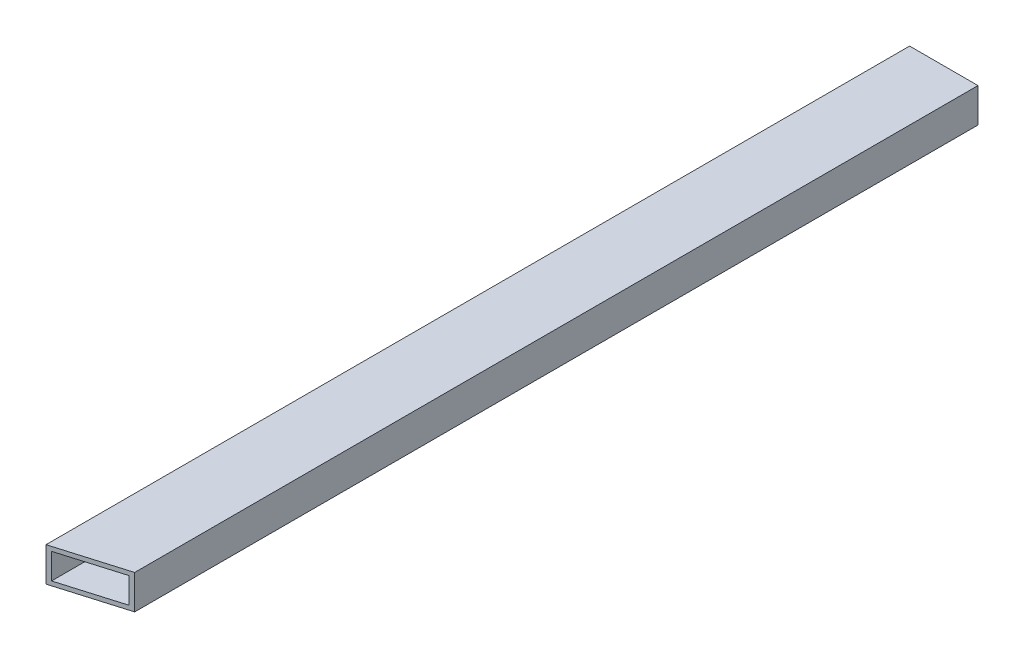
ISO-10303-21;
HEADER;
FILE_DESCRIPTION(('STEP AP214'),'2;1');
FILE_NAME('part.step','',(''),(''),'','','');
FILE_SCHEMA(('AUTOMOTIVE_DESIGN { 1 0 10303 214 1 1 1 1 }'));
ENDSEC;
DATA;
#1=APPLICATION_CONTEXT('core data for automotive mechanical design processes');
#2=APPLICATION_PROTOCOL_DEFINITION('international standard','automotive_design',2000,#1);
#3=PRODUCT_CONTEXT('',#1,'mechanical');
#4=PRODUCT('Part','Part','',(#3));
#5=PRODUCT_RELATED_PRODUCT_CATEGORY('part','',(#4));
#6=PRODUCT_DEFINITION_FORMATION('','',#4);
#7=PRODUCT_DEFINITION_CONTEXT('part definition',#1,'design');
#8=PRODUCT_DEFINITION('design','',#6,#7);
#9=PRODUCT_DEFINITION_SHAPE('','',#8);
#10=(LENGTH_UNIT() NAMED_UNIT(*) SI_UNIT(.MILLI.,.METRE.));
#11=(NAMED_UNIT(*) PLANE_ANGLE_UNIT() SI_UNIT($,.RADIAN.));
#12=(NAMED_UNIT(*) SI_UNIT($,.STERADIAN.) SOLID_ANGLE_UNIT());
#13=UNCERTAINTY_MEASURE_WITH_UNIT(LENGTH_MEASURE(1.E-05),#10,'distance_accuracy_value','');
#14=(GEOMETRIC_REPRESENTATION_CONTEXT(3) GLOBAL_UNCERTAINTY_ASSIGNED_CONTEXT((#13)) GLOBAL_UNIT_ASSIGNED_CONTEXT((#10,
#11,#12)) REPRESENTATION_CONTEXT('',''));
#15=CARTESIAN_POINT('',(0.,0.,0.));
#16=DIRECTION('',(0.,0.,1.));
#17=DIRECTION('',(1.,0.,0.));
#18=AXIS2_PLACEMENT_3D('',#15,#16,#17);
#19=CARTESIAN_POINT('',(-25.4,12.7,320.675));
#20=DIRECTION('',(1.,0.,0.));
#21=DIRECTION('',(0.,0.,-1.));
#22=AXIS2_PLACEMENT_3D('',#19,#20,#21);
#23=PLANE('',#22);
#24=DIRECTION('',(0.,0.,-1.));
#25=VECTOR('',#24,1.);
#26=CARTESIAN_POINT('',(-25.4,12.7,320.675));
#27=LINE('',#26,#25);
#28=CARTESIAN_POINT('',(-25.4,12.7,320.675));
#29=VERTEX_POINT('',#28);
#30=CARTESIAN_POINT('',(-25.4,12.7,-320.675));
#31=VERTEX_POINT('',#30);
#32=EDGE_CURVE('E118',#29,#31,#27,.T.);
#33=ORIENTED_EDGE('',*,*,#32,.T.);
#34=DIRECTION('',(0.,-1.,0.));
#35=VECTOR('',#34,1.);
#36=CARTESIAN_POINT('',(-25.4,12.7,-320.675));
#37=LINE('',#36,#35);
#38=CARTESIAN_POINT('',(-25.4,-12.7,-320.675));
#39=VERTEX_POINT('',#38);
#40=EDGE_CURVE('E151',#31,#39,#37,.T.);
#41=ORIENTED_EDGE('',*,*,#40,.T.);
#42=DIRECTION('',(0.,0.,-1.));
#43=VECTOR('',#42,1.);
#44=CARTESIAN_POINT('',(-25.4,-12.7,320.675));
#45=LINE('',#44,#43);
#46=CARTESIAN_POINT('',(-25.4,-12.7,320.675));
#47=VERTEX_POINT('',#46);
#48=EDGE_CURVE('E51',#47,#39,#45,.T.);
#49=ORIENTED_EDGE('',*,*,#48,.F.);
#50=DIRECTION('',(0.,-1.,0.));
#51=VECTOR('',#50,1.);
#52=CARTESIAN_POINT('',(-25.4,12.7,320.675));
#53=LINE('',#52,#51);
#54=EDGE_CURVE('E110',#29,#47,#53,.T.);
#55=ORIENTED_EDGE('',*,*,#54,.F.);
#56=EDGE_LOOP('',(#33,#41,#49,#55));
#57=FACE_BOUND('',#56,.T.);
#58=ADVANCED_FACE('F43',(#57),#23,.F.);
#59=CARTESIAN_POINT('',(-25.4,-12.7,320.675));
#60=DIRECTION('',(0.,1.,0.));
#61=DIRECTION('',(-1.,0.,0.));
#62=AXIS2_PLACEMENT_3D('',#59,#60,#61);
#63=PLANE('',#62);
#64=DIRECTION('',(0.,0.,-1.));
#65=VECTOR('',#64,1.);
#66=CARTESIAN_POINT('',(25.4,-12.7,320.675));
#67=LINE('',#66,#65);
#68=CARTESIAN_POINT('',(25.4,-12.7,305.627354455926));
#69=VERTEX_POINT('',#68);
#70=CARTESIAN_POINT('',(25.4,-12.7,-320.675));
#71=VERTEX_POINT('',#70);
#72=EDGE_CURVE('E139',#69,#71,#67,.T.);
#73=ORIENTED_EDGE('',*,*,#72,.F.);
#74=DIRECTION('',(-0.958819734868193,0.,0.284015344703924));
#75=VECTOR('',#74,1.);
#76=CARTESIAN_POINT('',(-25.4,-12.7,320.675));
#77=LINE('',#76,#75);
#78=EDGE_CURVE('E115',#69,#47,#77,.T.);
#79=ORIENTED_EDGE('',*,*,#78,.T.);
#80=ORIENTED_EDGE('',*,*,#48,.T.);
#81=DIRECTION('',(1.,0.,0.));
#82=VECTOR('',#81,1.);
#83=CARTESIAN_POINT('',(-25.4,-12.7,-320.675));
#84=LINE('',#83,#82);
#85=EDGE_CURVE('E147',#39,#71,#84,.T.);
#86=ORIENTED_EDGE('',*,*,#85,.T.);
#87=EDGE_LOOP('',(#73,#79,#80,#86));
#88=FACE_BOUND('',#87,.T.);
#89=ADVANCED_FACE('F146',(#88),#63,.F.);
#90=CARTESIAN_POINT('',(25.4,-12.7,320.675));
#91=DIRECTION('',(-1.,0.,0.));
#92=DIRECTION('',(0.,0.,1.));
#93=AXIS2_PLACEMENT_3D('',#90,#91,#92);
#94=PLANE('',#93);
#95=DIRECTION('',(0.,0.,-1.));
#96=VECTOR('',#95,1.);
#97=CARTESIAN_POINT('',(25.4,12.7,320.675));
#98=LINE('',#97,#96);
#99=CARTESIAN_POINT('',(25.4,12.7,305.627354455926));
#100=VERTEX_POINT('',#99);
#101=CARTESIAN_POINT('',(25.4,12.7,-320.675));
#102=VERTEX_POINT('',#101);
#103=EDGE_CURVE('E126',#100,#102,#98,.T.);
#104=ORIENTED_EDGE('',*,*,#103,.F.);
#105=DIRECTION('',(0.,-1.,0.));
#106=VECTOR('',#105,1.);
#107=CARTESIAN_POINT('',(25.4,849.274925158416,305.627354455926));
#108=LINE('',#107,#106);
#109=EDGE_CURVE('E58',#100,#69,#108,.T.);
#110=ORIENTED_EDGE('',*,*,#109,.T.);
#111=ORIENTED_EDGE('',*,*,#72,.T.);
#112=DIRECTION('',(0.,1.,0.));
#113=VECTOR('',#112,1.);
#114=CARTESIAN_POINT('',(25.4,-12.7,-320.675));
#115=LINE('',#114,#113);
#116=EDGE_CURVE('E153',#71,#102,#115,.T.);
#117=ORIENTED_EDGE('',*,*,#116,.T.);
#118=EDGE_LOOP('',(#104,#110,#111,#117));
#119=FACE_BOUND('',#118,.T.);
#120=ADVANCED_FACE('F211',(#119),#94,.F.);
#121=CARTESIAN_POINT('',(25.4,12.7,320.675));
#122=DIRECTION('',(0.,-1.,0.));
#123=DIRECTION('',(1.,0.,0.));
#124=AXIS2_PLACEMENT_3D('',#121,#122,#123);
#125=PLANE('',#124);
#126=ORIENTED_EDGE('',*,*,#32,.F.);
#127=DIRECTION('',(0.958819734868193,0.,-0.284015344703924));
#128=VECTOR('',#127,1.);
#129=CARTESIAN_POINT('',(21.3022324258137,12.7,306.841168510618));
#130=LINE('',#129,#128);
#131=EDGE_CURVE('E106',#29,#100,#130,.T.);
#132=ORIENTED_EDGE('',*,*,#131,.T.);
#133=ORIENTED_EDGE('',*,*,#103,.T.);
#134=DIRECTION('',(-1.,0.,0.));
#135=VECTOR('',#134,1.);
#136=CARTESIAN_POINT('',(25.4,12.7,-320.675));
#137=LINE('',#136,#135);
#138=EDGE_CURVE('E121',#102,#31,#137,.T.);
#139=ORIENTED_EDGE('',*,*,#138,.T.);
#140=EDGE_LOOP('',(#126,#132,#133,#139));
#141=FACE_BOUND('',#140,.T.);
#142=ADVANCED_FACE('F119',(#141),#125,.F.);
#143=CARTESIAN_POINT('',(-22.225,9.525,320.675));
#144=DIRECTION('',(1.,0.,0.));
#145=DIRECTION('',(0.,1.,0.));
#146=AXIS2_PLACEMENT_3D('',#143,#144,#145);
#147=PLANE('',#146);
#148=DIRECTION('',(0.,1.,0.));
#149=VECTOR('',#148,1.);
#150=CARTESIAN_POINT('',(-22.225,9.525,319.734522153495));
#151=LINE('',#150,#149);
#152=CARTESIAN_POINT('',(-22.225,-9.525,319.734522153495));
#153=VERTEX_POINT('',#152);
#154=CARTESIAN_POINT('',(-22.225,9.525,319.734522153495));
#155=VERTEX_POINT('',#154);
#156=EDGE_CURVE('E66',#153,#155,#151,.T.);
#157=ORIENTED_EDGE('',*,*,#156,.F.);
#158=DIRECTION('',(0.,0.,-1.));
#159=VECTOR('',#158,1.);
#160=CARTESIAN_POINT('',(-22.225,-9.525,320.675));
#161=LINE('',#160,#159);
#162=CARTESIAN_POINT('',(-22.225,-9.525,-320.675));
#163=VERTEX_POINT('',#162);
#164=EDGE_CURVE('E130',#153,#163,#161,.T.);
#165=ORIENTED_EDGE('',*,*,#164,.T.);
#166=DIRECTION('',(0.,-1.,0.));
#167=VECTOR('',#166,1.);
#168=CARTESIAN_POINT('',(-22.225,9.525,-320.675));
#169=LINE('',#168,#167);
#170=CARTESIAN_POINT('',(-22.225,9.525,-320.675));
#171=VERTEX_POINT('',#170);
#172=EDGE_CURVE('E194',#171,#163,#169,.T.);
#173=ORIENTED_EDGE('',*,*,#172,.F.);
#174=DIRECTION('',(0.,0.,-1.));
#175=VECTOR('',#174,1.);
#176=CARTESIAN_POINT('',(-22.225,9.525,320.675));
#177=LINE('',#176,#175);
#178=EDGE_CURVE('E169',#155,#171,#177,.T.);
#179=ORIENTED_EDGE('',*,*,#178,.F.);
#180=EDGE_LOOP('',(#157,#165,#173,#179));
#181=FACE_BOUND('',#180,.T.);
#182=ADVANCED_FACE('F218',(#181),#147,.T.);
#183=CARTESIAN_POINT('',(-22.225,-9.525,320.675));
#184=DIRECTION('',(0.,1.,0.));
#185=DIRECTION('',(0.,0.,1.));
#186=AXIS2_PLACEMENT_3D('',#183,#184,#185);
#187=PLANE('',#186);
#188=DIRECTION('',(-0.958819734868193,0.,0.284015344703924));
#189=VECTOR('',#188,1.);
#190=CARTESIAN_POINT('',(-22.4811104733866,-9.525,319.810385531914));
#191=LINE('',#190,#189);
#192=CARTESIAN_POINT('',(22.225,-9.525,306.567832302431));
#193=VERTEX_POINT('',#192);
#194=EDGE_CURVE('E184',#193,#153,#191,.T.);
#195=ORIENTED_EDGE('',*,*,#194,.F.);
#196=DIRECTION('',(0.,0.,-1.));
#197=VECTOR('',#196,1.);
#198=CARTESIAN_POINT('',(22.225,-9.525,320.675));
#199=LINE('',#198,#197);
#200=CARTESIAN_POINT('',(22.225,-9.525,-320.675));
#201=VERTEX_POINT('',#200);
#202=EDGE_CURVE('E133',#193,#201,#199,.T.);
#203=ORIENTED_EDGE('',*,*,#202,.T.);
#204=DIRECTION('',(1.,0.,0.));
#205=VECTOR('',#204,1.);
#206=CARTESIAN_POINT('',(-22.225,-9.525,-320.675));
#207=LINE('',#206,#205);
#208=EDGE_CURVE('E181',#163,#201,#207,.T.);
#209=ORIENTED_EDGE('',*,*,#208,.F.);
#210=ORIENTED_EDGE('',*,*,#164,.F.);
#211=EDGE_LOOP('',(#195,#203,#209,#210));
#212=FACE_BOUND('',#211,.T.);
#213=ADVANCED_FACE('F179',(#212),#187,.T.);
#214=CARTESIAN_POINT('',(22.225,-9.525,320.675));
#215=DIRECTION('',(-1.,0.,0.));
#216=DIRECTION('',(0.,-1.,0.));
#217=AXIS2_PLACEMENT_3D('',#214,#215,#216);
#218=PLANE('',#217);
#219=DIRECTION('',(0.,-1.,0.));
#220=VECTOR('',#219,1.);
#221=CARTESIAN_POINT('',(22.225,-9.525,306.567832302431));
#222=LINE('',#221,#220);
#223=CARTESIAN_POINT('',(22.225,9.525,306.567832302431));
#224=VERTEX_POINT('',#223);
#225=EDGE_CURVE('E206',#224,#193,#222,.T.);
#226=ORIENTED_EDGE('',*,*,#225,.F.);
#227=DIRECTION('',(0.,0.,-1.));
#228=VECTOR('',#227,1.);
#229=CARTESIAN_POINT('',(22.225,9.525,320.675));
#230=LINE('',#229,#228);
#231=CARTESIAN_POINT('',(22.225,9.525,-320.675));
#232=VERTEX_POINT('',#231);
#233=EDGE_CURVE('E172',#224,#232,#230,.T.);
#234=ORIENTED_EDGE('',*,*,#233,.T.);
#235=DIRECTION('',(0.,1.,0.));
#236=VECTOR('',#235,1.);
#237=CARTESIAN_POINT('',(22.225,-9.525,-320.675));
#238=LINE('',#237,#236);
#239=EDGE_CURVE('E161',#201,#232,#238,.T.);
#240=ORIENTED_EDGE('',*,*,#239,.F.);
#241=ORIENTED_EDGE('',*,*,#202,.F.);
#242=EDGE_LOOP('',(#226,#234,#240,#241));
#243=FACE_BOUND('',#242,.T.);
#244=ADVANCED_FACE('F189',(#243),#218,.T.);
#245=CARTESIAN_POINT('',(22.225,9.525,320.675));
#246=DIRECTION('',(0.,-1.,0.));
#247=DIRECTION('',(0.,0.,-1.));
#248=AXIS2_PLACEMENT_3D('',#245,#246,#247);
#249=PLANE('',#248);
#250=DIRECTION('',(0.958819734868193,0.,-0.284015344703924));
#251=VECTOR('',#250,1.);
#252=CARTESIAN_POINT('',(18.3833428992004,9.525,307.705782978705));
#253=LINE('',#252,#251);
#254=EDGE_CURVE('E11',#155,#224,#253,.T.);
#255=ORIENTED_EDGE('',*,*,#254,.F.);
#256=ORIENTED_EDGE('',*,*,#178,.T.);
#257=DIRECTION('',(-1.,0.,0.));
#258=VECTOR('',#257,1.);
#259=CARTESIAN_POINT('',(22.225,9.525,-320.675));
#260=LINE('',#259,#258);
#261=EDGE_CURVE('E157',#232,#171,#260,.T.);
#262=ORIENTED_EDGE('',*,*,#261,.F.);
#263=ORIENTED_EDGE('',*,*,#233,.F.);
#264=EDGE_LOOP('',(#255,#256,#262,#263));
#265=FACE_BOUND('',#264,.T.);
#266=ADVANCED_FACE('F268',(#265),#249,.T.);
#267=CARTESIAN_POINT('',(0.,0.,-320.675));
#268=DIRECTION('',(0.,0.,1.));
#269=DIRECTION('',(1.,0.,0.));
#270=AXIS2_PLACEMENT_3D('',#267,#268,#269);
#271=PLANE('',#270);
#272=ORIENTED_EDGE('',*,*,#261,.T.);
#273=ORIENTED_EDGE('',*,*,#172,.T.);
#274=ORIENTED_EDGE('',*,*,#208,.T.);
#275=ORIENTED_EDGE('',*,*,#239,.T.);
#276=EDGE_LOOP('',(#272,#273,#274,#275));
#277=FACE_BOUND('',#276,.T.);
#278=ORIENTED_EDGE('',*,*,#40,.F.);
#279=ORIENTED_EDGE('',*,*,#138,.F.);
#280=ORIENTED_EDGE('',*,*,#116,.F.);
#281=ORIENTED_EDGE('',*,*,#85,.F.);
#282=EDGE_LOOP('',(#278,#279,#280,#281));
#283=FACE_BOUND('',#282,.T.);
#284=ADVANCED_FACE('F150',(#277,#283),#271,.F.);
#285=CARTESIAN_POINT('',(-25.4,849.274925158416,320.675));
#286=DIRECTION('',(-0.284015344703924,0.,-0.958819734868193));
#287=DIRECTION('',(-0.958819734868193,0.,0.284015344703924));
#288=AXIS2_PLACEMENT_3D('',#285,#286,#287);
#289=PLANE('',#288);
#290=ORIENTED_EDGE('',*,*,#194,.T.);
#291=ORIENTED_EDGE('',*,*,#156,.T.);
#292=ORIENTED_EDGE('',*,*,#254,.T.);
#293=ORIENTED_EDGE('',*,*,#225,.T.);
#294=EDGE_LOOP('',(#290,#291,#292,#293));
#295=FACE_BOUND('',#294,.T.);
#296=ORIENTED_EDGE('',*,*,#78,.F.);
#297=ORIENTED_EDGE('',*,*,#109,.F.);
#298=ORIENTED_EDGE('',*,*,#131,.F.);
#299=ORIENTED_EDGE('',*,*,#54,.T.);
#300=EDGE_LOOP('',(#296,#297,#298,#299));
#301=FACE_BOUND('',#300,.T.);
#302=ADVANCED_FACE('F108',(#295,#301),#289,.F.);
#303=CLOSED_SHELL('',(#58,#89,#120,#142,#182,#213,#244,#266,#284,#302));
#304=MANIFOLD_SOLID_BREP('B2',#303);
#305=ADVANCED_BREP_SHAPE_REPRESENTATION('',(#18,#304),#14);
#306=SHAPE_DEFINITION_REPRESENTATION(#9,#305);
ENDSEC;
END-ISO-10303-21;
